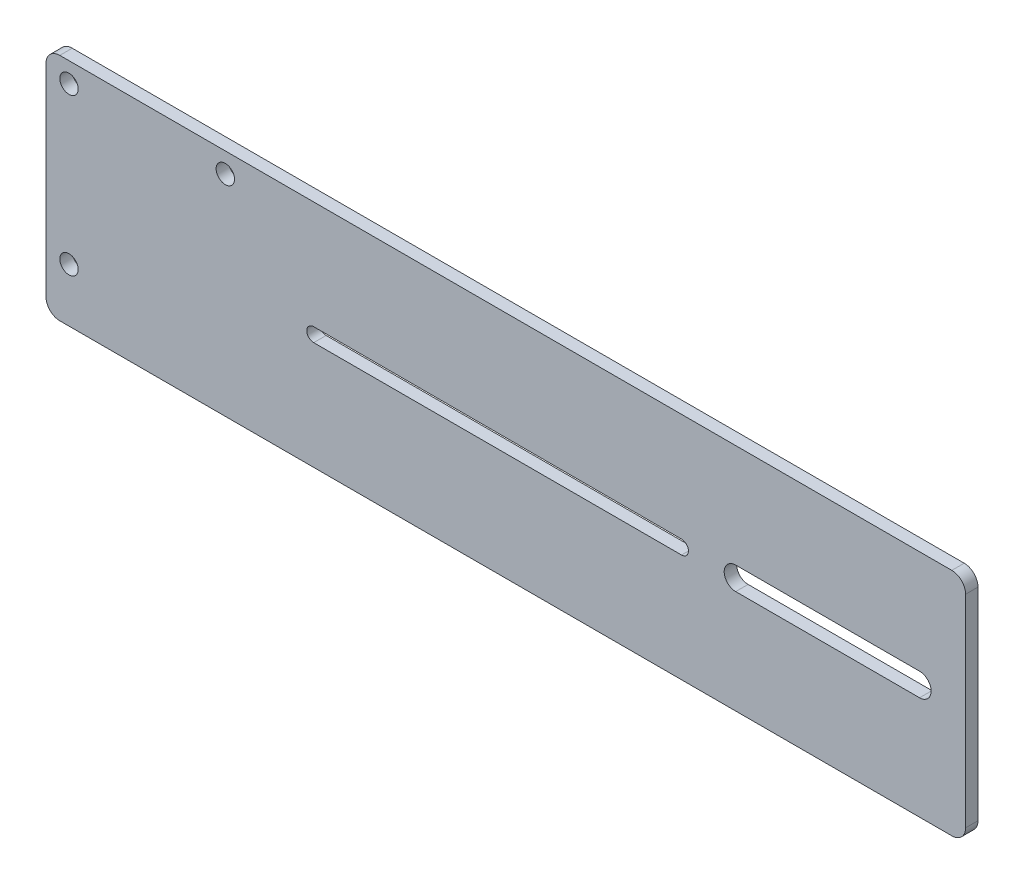
ISO-10303-21;
HEADER;
FILE_DESCRIPTION(('STEP AP214'),'2;1');
FILE_NAME('part.step','',(''),(''),'','','');
FILE_SCHEMA(('AUTOMOTIVE_DESIGN { 1 0 10303 214 1 1 1 1 }'));
ENDSEC;
DATA;
#1=APPLICATION_CONTEXT('core data for automotive mechanical design processes');
#2=APPLICATION_PROTOCOL_DEFINITION('international standard','automotive_design',2000,#1);
#3=PRODUCT_CONTEXT('',#1,'mechanical');
#4=PRODUCT('Part','Part','',(#3));
#5=PRODUCT_RELATED_PRODUCT_CATEGORY('part','',(#4));
#6=PRODUCT_DEFINITION_FORMATION('','',#4);
#7=PRODUCT_DEFINITION_CONTEXT('part definition',#1,'design');
#8=PRODUCT_DEFINITION('design','',#6,#7);
#9=PRODUCT_DEFINITION_SHAPE('','',#8);
#10=(LENGTH_UNIT() NAMED_UNIT(*) SI_UNIT(.MILLI.,.METRE.));
#11=(NAMED_UNIT(*) PLANE_ANGLE_UNIT() SI_UNIT($,.RADIAN.));
#12=(NAMED_UNIT(*) SI_UNIT($,.STERADIAN.) SOLID_ANGLE_UNIT());
#13=UNCERTAINTY_MEASURE_WITH_UNIT(LENGTH_MEASURE(1.E-05),#10,'distance_accuracy_value','');
#14=(GEOMETRIC_REPRESENTATION_CONTEXT(3) GLOBAL_UNCERTAINTY_ASSIGNED_CONTEXT((#13)) GLOBAL_UNIT_ASSIGNED_CONTEXT((#10,
#11,#12)) REPRESENTATION_CONTEXT('',''));
#15=CARTESIAN_POINT('',(0.,0.,0.));
#16=DIRECTION('',(0.,0.,1.));
#17=DIRECTION('',(1.,0.,0.));
#18=AXIS2_PLACEMENT_3D('',#15,#16,#17);
#19=CARTESIAN_POINT('',(3.,22.,2.7));
#20=DIRECTION('',(0.,0.,-1.));
#21=DIRECTION('',(-1.,0.,0.));
#22=AXIS2_PLACEMENT_3D('',#19,#20,#21);
#23=CYLINDRICAL_SURFACE('',#22,3.);
#24=CARTESIAN_POINT('',(3.,22.,0.));
#25=DIRECTION('',(0.,0.,1.));
#26=DIRECTION('',(1.,0.,0.));
#27=AXIS2_PLACEMENT_3D('',#24,#25,#26);
#28=CIRCLE('',#27,3.);
#29=CARTESIAN_POINT('',(0.,22.,0.));
#30=VERTEX_POINT('',#29);
#31=CARTESIAN_POINT('',(3.00000000000002,25.,0.));
#32=VERTEX_POINT('',#31);
#33=EDGE_CURVE('E222',#30,#32,#28,.F.);
#34=ORIENTED_EDGE('',*,*,#33,.F.);
#35=DIRECTION('',(0.,0.,-1.));
#36=VECTOR('',#35,1.);
#37=CARTESIAN_POINT('',(0.,22.,2.7));
#38=LINE('',#37,#36);
#39=CARTESIAN_POINT('',(0.,22.,2.7));
#40=VERTEX_POINT('',#39);
#41=EDGE_CURVE('E11',#40,#30,#38,.T.);
#42=ORIENTED_EDGE('',*,*,#41,.F.);
#43=CARTESIAN_POINT('',(3.,22.,2.7));
#44=DIRECTION('',(0.,0.,1.));
#45=DIRECTION('',(1.,0.,0.));
#46=AXIS2_PLACEMENT_3D('',#43,#44,#45);
#47=CIRCLE('',#46,3.);
#48=CARTESIAN_POINT('',(3.00000000000002,25.,2.7));
#49=VERTEX_POINT('',#48);
#50=EDGE_CURVE('E307',#40,#49,#47,.F.);
#51=ORIENTED_EDGE('',*,*,#50,.T.);
#52=DIRECTION('',(0.,0.,-1.));
#53=VECTOR('',#52,1.);
#54=CARTESIAN_POINT('',(3.00000000000002,25.,2.7));
#55=LINE('',#54,#53);
#56=EDGE_CURVE('E56',#49,#32,#55,.T.);
#57=ORIENTED_EDGE('',*,*,#56,.T.);
#58=EDGE_LOOP('',(#34,#42,#51,#57));
#59=FACE_BOUND('',#58,.T.);
#60=ADVANCED_FACE('F37',(#59),#23,.T.);
#61=CARTESIAN_POINT('',(0.,0.,2.7));
#62=DIRECTION('',(1.,0.,0.));
#63=DIRECTION('',(0.,1.,0.));
#64=AXIS2_PLACEMENT_3D('',#61,#62,#63);
#65=PLANE('',#64);
#66=DIRECTION('',(0.,-1.,0.));
#67=VECTOR('',#66,1.);
#68=CARTESIAN_POINT('',(0.,0.,0.));
#69=LINE('',#68,#67);
#70=CARTESIAN_POINT('',(0.,-22.,0.));
#71=VERTEX_POINT('',#70);
#72=EDGE_CURVE('E224',#30,#71,#69,.T.);
#73=ORIENTED_EDGE('',*,*,#72,.T.);
#74=DIRECTION('',(0.,0.,-1.));
#75=VECTOR('',#74,1.);
#76=CARTESIAN_POINT('',(0.,-22.,2.7));
#77=LINE('',#76,#75);
#78=CARTESIAN_POINT('',(0.,-22.,2.7));
#79=VERTEX_POINT('',#78);
#80=EDGE_CURVE('E47',#79,#71,#77,.T.);
#81=ORIENTED_EDGE('',*,*,#80,.F.);
#82=DIRECTION('',(0.,-1.,0.));
#83=VECTOR('',#82,1.);
#84=CARTESIAN_POINT('',(0.,0.,2.7));
#85=LINE('',#84,#83);
#86=EDGE_CURVE('E309',#40,#79,#85,.T.);
#87=ORIENTED_EDGE('',*,*,#86,.F.);
#88=ORIENTED_EDGE('',*,*,#41,.T.);
#89=EDGE_LOOP('',(#73,#81,#87,#88));
#90=FACE_BOUND('',#89,.T.);
#91=ADVANCED_FACE('F336',(#90),#65,.F.);
#92=CARTESIAN_POINT('',(3.00000000000001,-22.,2.7));
#93=DIRECTION('',(0.,0.,-1.));
#94=DIRECTION('',(-1.,0.,0.));
#95=AXIS2_PLACEMENT_3D('',#92,#93,#94);
#96=CYLINDRICAL_SURFACE('',#95,3.);
#97=CARTESIAN_POINT('',(3.00000000000001,-22.,0.));
#98=DIRECTION('',(0.,0.,1.));
#99=DIRECTION('',(1.,0.,0.));
#100=AXIS2_PLACEMENT_3D('',#97,#98,#99);
#101=CIRCLE('',#100,3.);
#102=CARTESIAN_POINT('',(3.00000000000003,-25.,0.));
#103=VERTEX_POINT('',#102);
#104=EDGE_CURVE('E227',#71,#103,#101,.T.);
#105=ORIENTED_EDGE('',*,*,#104,.T.);
#106=DIRECTION('',(0.,0.,-1.));
#107=VECTOR('',#106,1.);
#108=CARTESIAN_POINT('',(3.00000000000003,-25.,2.7));
#109=LINE('',#108,#107);
#110=CARTESIAN_POINT('',(3.00000000000003,-25.,2.7));
#111=VERTEX_POINT('',#110);
#112=EDGE_CURVE('E248',#111,#103,#109,.T.);
#113=ORIENTED_EDGE('',*,*,#112,.F.);
#114=CARTESIAN_POINT('',(3.00000000000001,-22.,2.7));
#115=DIRECTION('',(0.,0.,1.));
#116=DIRECTION('',(1.,0.,0.));
#117=AXIS2_PLACEMENT_3D('',#114,#115,#116);
#118=CIRCLE('',#117,3.);
#119=EDGE_CURVE('E312',#79,#111,#118,.T.);
#120=ORIENTED_EDGE('',*,*,#119,.F.);
#121=ORIENTED_EDGE('',*,*,#80,.T.);
#122=EDGE_LOOP('',(#105,#113,#120,#121));
#123=FACE_BOUND('',#122,.T.);
#124=ADVANCED_FACE('F341',(#123),#96,.T.);
#125=CARTESIAN_POINT('',(0.,-25.,2.7));
#126=DIRECTION('',(0.,1.,0.));
#127=DIRECTION('',(0.,0.,1.));
#128=AXIS2_PLACEMENT_3D('',#125,#126,#127);
#129=PLANE('',#128);
#130=DIRECTION('',(1.,0.,0.));
#131=VECTOR('',#130,1.);
#132=CARTESIAN_POINT('',(0.,-25.,0.));
#133=LINE('',#132,#131);
#134=CARTESIAN_POINT('',(197.,-25.,0.));
#135=VERTEX_POINT('',#134);
#136=EDGE_CURVE('E230',#103,#135,#133,.T.);
#137=ORIENTED_EDGE('',*,*,#136,.T.);
#138=DIRECTION('',(0.,0.,-1.));
#139=VECTOR('',#138,1.);
#140=CARTESIAN_POINT('',(197.,-25.,2.7));
#141=LINE('',#140,#139);
#142=CARTESIAN_POINT('',(197.,-25.,2.7));
#143=VERTEX_POINT('',#142);
#144=EDGE_CURVE('E246',#143,#135,#141,.T.);
#145=ORIENTED_EDGE('',*,*,#144,.F.);
#146=DIRECTION('',(1.,0.,0.));
#147=VECTOR('',#146,1.);
#148=CARTESIAN_POINT('',(0.,-25.,2.7));
#149=LINE('',#148,#147);
#150=EDGE_CURVE('E183',#111,#143,#149,.T.);
#151=ORIENTED_EDGE('',*,*,#150,.F.);
#152=ORIENTED_EDGE('',*,*,#112,.T.);
#153=EDGE_LOOP('',(#137,#145,#151,#152));
#154=FACE_BOUND('',#153,.T.);
#155=ADVANCED_FACE('F317',(#154),#129,.F.);
#156=CARTESIAN_POINT('',(197.,-22.,2.7));
#157=DIRECTION('',(0.,0.,-1.));
#158=DIRECTION('',(-1.,0.,0.));
#159=AXIS2_PLACEMENT_3D('',#156,#157,#158);
#160=CYLINDRICAL_SURFACE('',#159,3.);
#161=CARTESIAN_POINT('',(197.,-22.,0.));
#162=DIRECTION('',(0.,0.,1.));
#163=DIRECTION('',(1.,0.,0.));
#164=AXIS2_PLACEMENT_3D('',#161,#162,#163);
#165=CIRCLE('',#164,3.);
#166=CARTESIAN_POINT('',(200.,-22.,0.));
#167=VERTEX_POINT('',#166);
#168=EDGE_CURVE('E233',#167,#135,#165,.F.);
#169=ORIENTED_EDGE('',*,*,#168,.F.);
#170=DIRECTION('',(0.,0.,-1.));
#171=VECTOR('',#170,1.);
#172=CARTESIAN_POINT('',(200.,-22.,2.7));
#173=LINE('',#172,#171);
#174=CARTESIAN_POINT('',(200.,-22.,2.7));
#175=VERTEX_POINT('',#174);
#176=EDGE_CURVE('E169',#175,#167,#173,.T.);
#177=ORIENTED_EDGE('',*,*,#176,.F.);
#178=CARTESIAN_POINT('',(197.,-22.,2.7));
#179=DIRECTION('',(0.,0.,1.));
#180=DIRECTION('',(1.,0.,0.));
#181=AXIS2_PLACEMENT_3D('',#178,#179,#180);
#182=CIRCLE('',#181,3.);
#183=EDGE_CURVE('E181',#175,#143,#182,.F.);
#184=ORIENTED_EDGE('',*,*,#183,.T.);
#185=ORIENTED_EDGE('',*,*,#144,.T.);
#186=EDGE_LOOP('',(#169,#177,#184,#185));
#187=FACE_BOUND('',#186,.T.);
#188=ADVANCED_FACE('F320',(#187),#160,.T.);
#189=CARTESIAN_POINT('',(200.,0.,2.7));
#190=DIRECTION('',(1.,0.,0.));
#191=DIRECTION('',(0.,0.,-1.));
#192=AXIS2_PLACEMENT_3D('',#189,#190,#191);
#193=PLANE('',#192);
#194=DIRECTION('',(0.,-1.,0.));
#195=VECTOR('',#194,1.);
#196=CARTESIAN_POINT('',(200.,0.,0.));
#197=LINE('',#196,#195);
#198=CARTESIAN_POINT('',(200.,22.,0.));
#199=VERTEX_POINT('',#198);
#200=EDGE_CURVE('E166',#199,#167,#197,.T.);
#201=ORIENTED_EDGE('',*,*,#200,.F.);
#202=DIRECTION('',(0.,0.,-1.));
#203=VECTOR('',#202,1.);
#204=CARTESIAN_POINT('',(200.,22.,2.7));
#205=LINE('',#204,#203);
#206=CARTESIAN_POINT('',(200.,22.,2.7));
#207=VERTEX_POINT('',#206);
#208=EDGE_CURVE('E160',#207,#199,#205,.T.);
#209=ORIENTED_EDGE('',*,*,#208,.F.);
#210=DIRECTION('',(0.,-1.,0.));
#211=VECTOR('',#210,1.);
#212=CARTESIAN_POINT('',(200.,0.,2.7));
#213=LINE('',#212,#211);
#214=EDGE_CURVE('E164',#207,#175,#213,.T.);
#215=ORIENTED_EDGE('',*,*,#214,.T.);
#216=ORIENTED_EDGE('',*,*,#176,.T.);
#217=EDGE_LOOP('',(#201,#209,#215,#216));
#218=FACE_BOUND('',#217,.T.);
#219=ADVANCED_FACE('F162',(#218),#193,.T.);
#220=CARTESIAN_POINT('',(197.,22.,2.7));
#221=DIRECTION('',(0.,0.,-1.));
#222=DIRECTION('',(-1.,0.,0.));
#223=AXIS2_PLACEMENT_3D('',#220,#221,#222);
#224=CYLINDRICAL_SURFACE('',#223,3.);
#225=CARTESIAN_POINT('',(197.,22.,0.));
#226=DIRECTION('',(0.,0.,1.));
#227=DIRECTION('',(1.,0.,0.));
#228=AXIS2_PLACEMENT_3D('',#225,#226,#227);
#229=CIRCLE('',#228,3.);
#230=CARTESIAN_POINT('',(197.,25.,0.));
#231=VERTEX_POINT('',#230);
#232=EDGE_CURVE('E237',#199,#231,#229,.T.);
#233=ORIENTED_EDGE('',*,*,#232,.T.);
#234=DIRECTION('',(0.,0.,-1.));
#235=VECTOR('',#234,1.);
#236=CARTESIAN_POINT('',(197.,25.,2.7));
#237=LINE('',#236,#235);
#238=CARTESIAN_POINT('',(197.,25.,2.7));
#239=VERTEX_POINT('',#238);
#240=EDGE_CURVE('E106',#239,#231,#237,.T.);
#241=ORIENTED_EDGE('',*,*,#240,.F.);
#242=CARTESIAN_POINT('',(197.,22.,2.7));
#243=DIRECTION('',(0.,0.,1.));
#244=DIRECTION('',(1.,0.,0.));
#245=AXIS2_PLACEMENT_3D('',#242,#243,#244);
#246=CIRCLE('',#245,3.);
#247=EDGE_CURVE('E171',#207,#239,#246,.T.);
#248=ORIENTED_EDGE('',*,*,#247,.F.);
#249=ORIENTED_EDGE('',*,*,#208,.T.);
#250=EDGE_LOOP('',(#233,#241,#248,#249));
#251=FACE_BOUND('',#250,.T.);
#252=ADVANCED_FACE('F172',(#251),#224,.T.);
#253=CARTESIAN_POINT('',(0.,-2.5,2.7));
#254=DIRECTION('',(0.,-1.,0.));
#255=DIRECTION('',(1.,0.,0.));
#256=AXIS2_PLACEMENT_3D('',#253,#254,#255);
#257=PLANE('',#256);
#258=DIRECTION('',(-1.,0.,0.));
#259=VECTOR('',#258,1.);
#260=CARTESIAN_POINT('',(0.,-2.5,0.));
#261=LINE('',#260,#259);
#262=CARTESIAN_POINT('',(190.,-2.5,0.));
#263=VERTEX_POINT('',#262);
#264=CARTESIAN_POINT('',(150.,-2.5,0.));
#265=VERTEX_POINT('',#264);
#266=EDGE_CURVE('E201',#263,#265,#261,.T.);
#267=ORIENTED_EDGE('',*,*,#266,.T.);
#268=DIRECTION('',(0.,0.,-1.));
#269=VECTOR('',#268,1.);
#270=CARTESIAN_POINT('',(150.,-2.5,2.7));
#271=LINE('',#270,#269);
#272=CARTESIAN_POINT('',(150.,-2.5,2.7));
#273=VERTEX_POINT('',#272);
#274=EDGE_CURVE('E243',#273,#265,#271,.T.);
#275=ORIENTED_EDGE('',*,*,#274,.F.);
#276=DIRECTION('',(-1.,0.,0.));
#277=VECTOR('',#276,1.);
#278=CARTESIAN_POINT('',(0.,-2.5,2.7));
#279=LINE('',#278,#277);
#280=CARTESIAN_POINT('',(190.,-2.5,2.7));
#281=VERTEX_POINT('',#280);
#282=EDGE_CURVE('E284',#281,#273,#279,.T.);
#283=ORIENTED_EDGE('',*,*,#282,.F.);
#284=DIRECTION('',(0.,0.,-1.));
#285=VECTOR('',#284,1.);
#286=CARTESIAN_POINT('',(190.,-2.5,2.7));
#287=LINE('',#286,#285);
#288=EDGE_CURVE('E253',#281,#263,#287,.T.);
#289=ORIENTED_EDGE('',*,*,#288,.T.);
#290=EDGE_LOOP('',(#267,#275,#283,#289));
#291=FACE_BOUND('',#290,.T.);
#292=ADVANCED_FACE('F368',(#291),#257,.F.);
#293=CARTESIAN_POINT('',(150.,0.,2.7));
#294=DIRECTION('',(0.,0.,-1.));
#295=DIRECTION('',(-1.,0.,0.));
#296=AXIS2_PLACEMENT_3D('',#293,#294,#295);
#297=CYLINDRICAL_SURFACE('',#296,2.5);
#298=CARTESIAN_POINT('',(150.,0.,0.));
#299=DIRECTION('',(0.,0.,1.));
#300=DIRECTION('',(1.,0.,0.));
#301=AXIS2_PLACEMENT_3D('',#298,#299,#300);
#302=CIRCLE('',#301,2.5);
#303=CARTESIAN_POINT('',(150.,2.5,0.));
#304=VERTEX_POINT('',#303);
#305=EDGE_CURVE('E204',#304,#265,#302,.T.);
#306=ORIENTED_EDGE('',*,*,#305,.F.);
#307=DIRECTION('',(0.,0.,-1.));
#308=VECTOR('',#307,1.);
#309=CARTESIAN_POINT('',(150.,2.5,2.7));
#310=LINE('',#309,#308);
#311=CARTESIAN_POINT('',(150.,2.5,2.7));
#312=VERTEX_POINT('',#311);
#313=EDGE_CURVE('E257',#312,#304,#310,.T.);
#314=ORIENTED_EDGE('',*,*,#313,.F.);
#315=CARTESIAN_POINT('',(150.,0.,2.7));
#316=DIRECTION('',(0.,0.,1.));
#317=DIRECTION('',(1.,0.,0.));
#318=AXIS2_PLACEMENT_3D('',#315,#316,#317);
#319=CIRCLE('',#318,2.5);
#320=EDGE_CURVE('E286',#312,#273,#319,.T.);
#321=ORIENTED_EDGE('',*,*,#320,.T.);
#322=ORIENTED_EDGE('',*,*,#274,.T.);
#323=EDGE_LOOP('',(#306,#314,#321,#322));
#324=FACE_BOUND('',#323,.T.);
#325=ADVANCED_FACE('F364',(#324),#297,.F.);
#326=CARTESIAN_POINT('',(0.,2.5,2.7));
#327=DIRECTION('',(0.,1.,0.));
#328=DIRECTION('',(0.,0.,1.));
#329=AXIS2_PLACEMENT_3D('',#326,#327,#328);
#330=PLANE('',#329);
#331=DIRECTION('',(1.,0.,0.));
#332=VECTOR('',#331,1.);
#333=CARTESIAN_POINT('',(0.,2.5,0.));
#334=LINE('',#333,#332);
#335=CARTESIAN_POINT('',(190.,2.5,0.));
#336=VERTEX_POINT('',#335);
#337=EDGE_CURVE('E207',#304,#336,#334,.T.);
#338=ORIENTED_EDGE('',*,*,#337,.T.);
#339=DIRECTION('',(0.,0.,-1.));
#340=VECTOR('',#339,1.);
#341=CARTESIAN_POINT('',(190.,2.5,2.7));
#342=LINE('',#341,#340);
#343=CARTESIAN_POINT('',(190.,2.5,2.7));
#344=VERTEX_POINT('',#343);
#345=EDGE_CURVE('E255',#344,#336,#342,.T.);
#346=ORIENTED_EDGE('',*,*,#345,.F.);
#347=DIRECTION('',(1.,0.,0.));
#348=VECTOR('',#347,1.);
#349=CARTESIAN_POINT('',(0.,2.5,2.7));
#350=LINE('',#349,#348);
#351=EDGE_CURVE('E293',#312,#344,#350,.T.);
#352=ORIENTED_EDGE('',*,*,#351,.F.);
#353=ORIENTED_EDGE('',*,*,#313,.T.);
#354=EDGE_LOOP('',(#338,#346,#352,#353));
#355=FACE_BOUND('',#354,.T.);
#356=ADVANCED_FACE('F361',(#355),#330,.F.);
#357=CARTESIAN_POINT('',(0.,-1.5,2.7));
#358=DIRECTION('',(0.,-1.,0.));
#359=DIRECTION('',(0.,0.,-1.));
#360=AXIS2_PLACEMENT_3D('',#357,#358,#359);
#361=PLANE('',#360);
#362=DIRECTION('',(-1.,0.,0.));
#363=VECTOR('',#362,1.);
#364=CARTESIAN_POINT('',(0.,-1.5,0.));
#365=LINE('',#364,#363);
#366=CARTESIAN_POINT('',(138.219392867782,-1.5,0.));
#367=VERTEX_POINT('',#366);
#368=CARTESIAN_POINT('',(58.2193928677821,-1.5,0.));
#369=VERTEX_POINT('',#368);
#370=EDGE_CURVE('E189',#367,#369,#365,.T.);
#371=ORIENTED_EDGE('',*,*,#370,.T.);
#372=DIRECTION('',(0.,0.,-1.));
#373=VECTOR('',#372,1.);
#374=CARTESIAN_POINT('',(58.2193928677821,-1.5,2.7));
#375=LINE('',#374,#373);
#376=CARTESIAN_POINT('',(58.2193928677821,-1.5,2.7));
#377=VERTEX_POINT('',#376);
#378=EDGE_CURVE('E41',#377,#369,#375,.T.);
#379=ORIENTED_EDGE('',*,*,#378,.F.);
#380=DIRECTION('',(-1.,0.,0.));
#381=VECTOR('',#380,1.);
#382=CARTESIAN_POINT('',(0.,-1.5,2.7));
#383=LINE('',#382,#381);
#384=CARTESIAN_POINT('',(138.219392867782,-1.5,2.7));
#385=VERTEX_POINT('',#384);
#386=EDGE_CURVE('E119',#385,#377,#383,.T.);
#387=ORIENTED_EDGE('',*,*,#386,.F.);
#388=DIRECTION('',(0.,0.,-1.));
#389=VECTOR('',#388,1.);
#390=CARTESIAN_POINT('',(138.219392867782,-1.5,2.7));
#391=LINE('',#390,#389);
#392=EDGE_CURVE('E188',#385,#367,#391,.T.);
#393=ORIENTED_EDGE('',*,*,#392,.T.);
#394=EDGE_LOOP('',(#371,#379,#387,#393));
#395=FACE_BOUND('',#394,.T.);
#396=ADVANCED_FACE('F39',(#395),#361,.F.);
#397=CARTESIAN_POINT('',(58.2193928677821,0.,2.7));
#398=DIRECTION('',(0.,0.,-1.));
#399=DIRECTION('',(-1.,0.,0.));
#400=AXIS2_PLACEMENT_3D('',#397,#398,#399);
#401=CYLINDRICAL_SURFACE('',#400,1.5);
#402=CARTESIAN_POINT('',(58.2193928677821,0.,0.));
#403=DIRECTION('',(0.,0.,1.));
#404=DIRECTION('',(1.,0.,0.));
#405=AXIS2_PLACEMENT_3D('',#402,#403,#404);
#406=CIRCLE('',#405,1.5);
#407=CARTESIAN_POINT('',(58.2193928677821,1.5,0.));
#408=VERTEX_POINT('',#407);
#409=EDGE_CURVE('E192',#408,#369,#406,.T.);
#410=ORIENTED_EDGE('',*,*,#409,.F.);
#411=DIRECTION('',(0.,0.,-1.));
#412=VECTOR('',#411,1.);
#413=CARTESIAN_POINT('',(58.2193928677821,1.5,2.7));
#414=LINE('',#413,#412);
#415=CARTESIAN_POINT('',(58.2193928677821,1.5,2.7));
#416=VERTEX_POINT('',#415);
#417=EDGE_CURVE('E262',#416,#408,#414,.T.);
#418=ORIENTED_EDGE('',*,*,#417,.F.);
#419=CARTESIAN_POINT('',(58.2193928677821,0.,2.7));
#420=DIRECTION('',(0.,0.,1.));
#421=DIRECTION('',(1.,0.,0.));
#422=AXIS2_PLACEMENT_3D('',#419,#420,#421);
#423=CIRCLE('',#422,1.5);
#424=EDGE_CURVE('E270',#416,#377,#423,.T.);
#425=ORIENTED_EDGE('',*,*,#424,.T.);
#426=ORIENTED_EDGE('',*,*,#378,.T.);
#427=EDGE_LOOP('',(#410,#418,#425,#426));
#428=FACE_BOUND('',#427,.T.);
#429=ADVANCED_FACE('F269',(#428),#401,.F.);
#430=CARTESIAN_POINT('',(0.,1.5,2.7));
#431=DIRECTION('',(0.,1.,0.));
#432=DIRECTION('',(0.,0.,1.));
#433=AXIS2_PLACEMENT_3D('',#430,#431,#432);
#434=PLANE('',#433);
#435=DIRECTION('',(1.,0.,0.));
#436=VECTOR('',#435,1.);
#437=CARTESIAN_POINT('',(0.,1.5,0.));
#438=LINE('',#437,#436);
#439=CARTESIAN_POINT('',(138.219392867782,1.5,0.));
#440=VERTEX_POINT('',#439);
#441=EDGE_CURVE('E195',#408,#440,#438,.T.);
#442=ORIENTED_EDGE('',*,*,#441,.T.);
#443=DIRECTION('',(0.,0.,-1.));
#444=VECTOR('',#443,1.);
#445=CARTESIAN_POINT('',(138.219392867782,1.5,2.7));
#446=LINE('',#445,#444);
#447=CARTESIAN_POINT('',(138.219392867782,1.5,2.7));
#448=VERTEX_POINT('',#447);
#449=EDGE_CURVE('E261',#448,#440,#446,.T.);
#450=ORIENTED_EDGE('',*,*,#449,.F.);
#451=DIRECTION('',(1.,0.,0.));
#452=VECTOR('',#451,1.);
#453=CARTESIAN_POINT('',(0.,1.5,2.7));
#454=LINE('',#453,#452);
#455=EDGE_CURVE('E280',#416,#448,#454,.T.);
#456=ORIENTED_EDGE('',*,*,#455,.F.);
#457=ORIENTED_EDGE('',*,*,#417,.T.);
#458=EDGE_LOOP('',(#442,#450,#456,#457));
#459=FACE_BOUND('',#458,.T.);
#460=ADVANCED_FACE('F278',(#459),#434,.F.);
#461=CARTESIAN_POINT('',(5.,20.65,2.7));
#462=DIRECTION('',(0.,0.,-1.));
#463=DIRECTION('',(-1.,0.,0.));
#464=AXIS2_PLACEMENT_3D('',#461,#462,#463);
#465=CYLINDRICAL_SURFACE('',#464,2.);
#466=CARTESIAN_POINT('',(5.,20.65,2.7));
#467=DIRECTION('',(0.,0.,1.));
#468=DIRECTION('',(1.,0.,0.));
#469=AXIS2_PLACEMENT_3D('',#466,#467,#468);
#470=CIRCLE('',#469,2.);
#471=CARTESIAN_POINT('',(3.,20.65,2.7));
#472=VERTEX_POINT('',#471);
#473=EDGE_CURVE('E304',#472,#472,#470,.T.);
#474=CARTESIAN_POINT('',(5.,20.65,0.));
#475=DIRECTION('',(0.,0.,1.));
#476=DIRECTION('',(1.,0.,0.));
#477=AXIS2_PLACEMENT_3D('',#474,#475,#476);
#478=CIRCLE('',#477,2.);
#479=CARTESIAN_POINT('',(3.,20.65,0.));
#480=VERTEX_POINT('',#479);
#481=EDGE_CURVE('E219',#480,#480,#478,.T.);
#482=CARTESIAN_POINT('',(3.,20.65,2.7));
#483=CARTESIAN_POINT('',(3.,20.65,2.671875));
#484=CARTESIAN_POINT('',(3.,20.65,2.64375));
#485=CARTESIAN_POINT('',(3.,20.65,2.5875));
#486=CARTESIAN_POINT('',(3.,20.65,2.559375));
#487=CARTESIAN_POINT('',(3.,20.65,2.503125));
#488=CARTESIAN_POINT('',(3.,20.65,2.475));
#489=CARTESIAN_POINT('',(3.,20.65,2.41875));
#490=CARTESIAN_POINT('',(3.,20.65,2.390625));
#491=CARTESIAN_POINT('',(3.,20.65,2.334375));
#492=CARTESIAN_POINT('',(3.,20.65,2.30625));
#493=CARTESIAN_POINT('',(3.,20.65,2.25));
#494=CARTESIAN_POINT('',(3.,20.65,2.221875));
#495=CARTESIAN_POINT('',(3.,20.65,2.165625));
#496=CARTESIAN_POINT('',(3.,20.65,2.1375));
#497=CARTESIAN_POINT('',(3.,20.65,2.08125));
#498=CARTESIAN_POINT('',(3.,20.65,2.053125));
#499=CARTESIAN_POINT('',(3.,20.65,1.996875));
#500=CARTESIAN_POINT('',(3.,20.65,1.96875));
#501=CARTESIAN_POINT('',(3.,20.65,1.9125));
#502=CARTESIAN_POINT('',(3.,20.65,1.884375));
#503=CARTESIAN_POINT('',(3.,20.65,1.828125));
#504=CARTESIAN_POINT('',(3.,20.65,1.8));
#505=CARTESIAN_POINT('',(3.,20.65,1.74375));
#506=CARTESIAN_POINT('',(3.,20.65,1.715625));
#507=CARTESIAN_POINT('',(3.,20.65,1.659375));
#508=CARTESIAN_POINT('',(3.,20.65,1.63125));
#509=CARTESIAN_POINT('',(3.,20.65,1.575));
#510=CARTESIAN_POINT('',(3.,20.65,1.546875));
#511=CARTESIAN_POINT('',(3.,20.65,1.490625));
#512=CARTESIAN_POINT('',(3.,20.65,1.4625));
#513=CARTESIAN_POINT('',(3.,20.65,1.40625));
#514=CARTESIAN_POINT('',(3.,20.65,1.378125));
#515=CARTESIAN_POINT('',(3.,20.65,1.321875));
#516=CARTESIAN_POINT('',(3.,20.65,1.29375));
#517=CARTESIAN_POINT('',(3.,20.65,1.2375));
#518=CARTESIAN_POINT('',(3.,20.65,1.209375));
#519=CARTESIAN_POINT('',(3.,20.65,1.153125));
#520=CARTESIAN_POINT('',(3.,20.65,1.125));
#521=CARTESIAN_POINT('',(3.,20.65,1.06875));
#522=CARTESIAN_POINT('',(3.,20.65,1.040625));
#523=CARTESIAN_POINT('',(3.,20.65,0.984375));
#524=CARTESIAN_POINT('',(3.,20.65,0.956249999999999));
#525=CARTESIAN_POINT('',(3.,20.65,0.899999999999999));
#526=CARTESIAN_POINT('',(3.,20.65,0.871875));
#527=CARTESIAN_POINT('',(3.,20.65,0.815624999999999));
#528=CARTESIAN_POINT('',(3.,20.65,0.787499999999999));
#529=CARTESIAN_POINT('',(3.,20.65,0.73125));
#530=CARTESIAN_POINT('',(3.,20.65,0.703125));
#531=CARTESIAN_POINT('',(3.,20.65,0.646875));
#532=CARTESIAN_POINT('',(3.,20.65,0.61875));
#533=CARTESIAN_POINT('',(3.,20.65,0.5625));
#534=CARTESIAN_POINT('',(3.,20.65,0.534375));
#535=CARTESIAN_POINT('',(3.,20.65,0.478125));
#536=CARTESIAN_POINT('',(3.,20.65,0.45));
#537=CARTESIAN_POINT('',(3.,20.65,0.39375));
#538=CARTESIAN_POINT('',(3.,20.65,0.365625));
#539=CARTESIAN_POINT('',(3.,20.65,0.309375));
#540=CARTESIAN_POINT('',(3.,20.65,0.28125));
#541=CARTESIAN_POINT('',(3.,20.65,0.225));
#542=CARTESIAN_POINT('',(3.,20.65,0.196875));
#543=CARTESIAN_POINT('',(3.,20.65,0.140625));
#544=CARTESIAN_POINT('',(3.,20.65,0.1125));
#545=CARTESIAN_POINT('',(3.,20.65,0.0562499999999997));
#546=CARTESIAN_POINT('',(3.,20.65,0.0281249999999996));
#547=CARTESIAN_POINT('',(3.,20.65,0.));
#548=B_SPLINE_CURVE_WITH_KNOTS('',3,(#482,#483,#484,#485,#486,#487,#488,#489,#490,#491,#492,
#493,#494,#495,#496,#497,#498,#499,#500,#501,#502,#503,#504,#505,#506,#507,#508,#509,#510,#511,
#512,#513,#514,#515,#516,#517,#518,#519,#520,#521,#522,#523,#524,#525,#526,#527,#528,#529,#530,
#531,#532,#533,#534,#535,#536,#537,#538,#539,#540,#541,#542,#543,#544,#545,#546,#547),
.UNSPECIFIED.,.F.,.F.,(4,2,2,2,2,2,2,2,2,2,2,2,2,2,2,2,2,2,2,2,2,2,2,2,2,2,2,2,2,2,2,2,4),(0.,
0.0843750000000003,0.16875,0.253125,0.3375,0.421875,0.50625,0.590625,0.675,0.759375,0.84375,
0.928125000000001,1.0125,1.096875,1.18125,1.265625,1.35,1.434375,1.51875,1.603125,1.6875,
1.771875,1.85625,1.940625,2.025,2.109375,2.19375,2.278125,2.3625,2.446875,2.53125,2.615625,2.7),.UNSPECIFIED.);
#549=EDGE_CURVE('BSEAM346',#472,#480,#548,.T.);
#550=ORIENTED_EDGE('',*,*,#473,.T.);
#551=ORIENTED_EDGE('',*,*,#481,.F.);
#552=ORIENTED_EDGE('',*,*,#549,.T.);
#553=ORIENTED_EDGE('',*,*,#549,.F.);
#554=EDGE_LOOP('',(#550,#552,#551,#553));
#555=FACE_BOUND('',#554,.T.);
#556=ADVANCED_FACE('F346',(#555),#465,.F.);
#557=CARTESIAN_POINT('',(39.,20.65,2.7));
#558=DIRECTION('',(0.,0.,-1.));
#559=DIRECTION('',(-1.,0.,0.));
#560=AXIS2_PLACEMENT_3D('',#557,#558,#559);
#561=CYLINDRICAL_SURFACE('',#560,2.);
#562=CARTESIAN_POINT('',(39.,20.65,2.7));
#563=DIRECTION('',(0.,0.,1.));
#564=DIRECTION('',(1.,0.,0.));
#565=AXIS2_PLACEMENT_3D('',#562,#563,#564);
#566=CIRCLE('',#565,2.);
#567=CARTESIAN_POINT('',(37.,20.65,2.7));
#568=VERTEX_POINT('',#567);
#569=EDGE_CURVE('E301',#568,#568,#566,.T.);
#570=CARTESIAN_POINT('',(39.,20.65,0.));
#571=DIRECTION('',(0.,0.,1.));
#572=DIRECTION('',(1.,0.,0.));
#573=AXIS2_PLACEMENT_3D('',#570,#571,#572);
#574=CIRCLE('',#573,2.);
#575=CARTESIAN_POINT('',(37.,20.65,0.));
#576=VERTEX_POINT('',#575);
#577=EDGE_CURVE('E216',#576,#576,#574,.T.);
#578=CARTESIAN_POINT('',(37.,20.65,2.7));
#579=CARTESIAN_POINT('',(37.,20.65,2.671875));
#580=CARTESIAN_POINT('',(37.,20.65,2.64375));
#581=CARTESIAN_POINT('',(37.,20.65,2.5875));
#582=CARTESIAN_POINT('',(37.,20.65,2.559375));
#583=CARTESIAN_POINT('',(37.,20.65,2.503125));
#584=CARTESIAN_POINT('',(37.,20.65,2.475));
#585=CARTESIAN_POINT('',(37.,20.65,2.41875));
#586=CARTESIAN_POINT('',(37.,20.65,2.390625));
#587=CARTESIAN_POINT('',(37.,20.65,2.334375));
#588=CARTESIAN_POINT('',(37.,20.65,2.30625));
#589=CARTESIAN_POINT('',(37.,20.65,2.25));
#590=CARTESIAN_POINT('',(37.,20.65,2.221875));
#591=CARTESIAN_POINT('',(37.,20.65,2.165625));
#592=CARTESIAN_POINT('',(37.,20.65,2.1375));
#593=CARTESIAN_POINT('',(37.,20.65,2.08125));
#594=CARTESIAN_POINT('',(37.,20.65,2.053125));
#595=CARTESIAN_POINT('',(37.,20.65,1.996875));
#596=CARTESIAN_POINT('',(37.,20.65,1.96875));
#597=CARTESIAN_POINT('',(37.,20.65,1.9125));
#598=CARTESIAN_POINT('',(37.,20.65,1.884375));
#599=CARTESIAN_POINT('',(37.,20.65,1.828125));
#600=CARTESIAN_POINT('',(37.,20.65,1.8));
#601=CARTESIAN_POINT('',(37.,20.65,1.74375));
#602=CARTESIAN_POINT('',(37.,20.65,1.715625));
#603=CARTESIAN_POINT('',(37.,20.65,1.659375));
#604=CARTESIAN_POINT('',(37.,20.65,1.63125));
#605=CARTESIAN_POINT('',(37.,20.65,1.575));
#606=CARTESIAN_POINT('',(37.,20.65,1.546875));
#607=CARTESIAN_POINT('',(37.,20.65,1.490625));
#608=CARTESIAN_POINT('',(37.,20.65,1.4625));
#609=CARTESIAN_POINT('',(37.,20.65,1.40625));
#610=CARTESIAN_POINT('',(37.,20.65,1.378125));
#611=CARTESIAN_POINT('',(37.,20.65,1.321875));
#612=CARTESIAN_POINT('',(37.,20.65,1.29375));
#613=CARTESIAN_POINT('',(37.,20.65,1.2375));
#614=CARTESIAN_POINT('',(37.,20.65,1.209375));
#615=CARTESIAN_POINT('',(37.,20.65,1.153125));
#616=CARTESIAN_POINT('',(37.,20.65,1.125));
#617=CARTESIAN_POINT('',(37.,20.65,1.06875));
#618=CARTESIAN_POINT('',(37.,20.65,1.040625));
#619=CARTESIAN_POINT('',(37.,20.65,0.984375));
#620=CARTESIAN_POINT('',(37.,20.65,0.956249999999999));
#621=CARTESIAN_POINT('',(37.,20.65,0.899999999999999));
#622=CARTESIAN_POINT('',(37.,20.65,0.871875));
#623=CARTESIAN_POINT('',(37.,20.65,0.815624999999999));
#624=CARTESIAN_POINT('',(37.,20.65,0.787499999999999));
#625=CARTESIAN_POINT('',(37.,20.65,0.73125));
#626=CARTESIAN_POINT('',(37.,20.65,0.703125));
#627=CARTESIAN_POINT('',(37.,20.65,0.646875));
#628=CARTESIAN_POINT('',(37.,20.65,0.61875));
#629=CARTESIAN_POINT('',(37.,20.65,0.5625));
#630=CARTESIAN_POINT('',(37.,20.65,0.534375));
#631=CARTESIAN_POINT('',(37.,20.65,0.478125));
#632=CARTESIAN_POINT('',(37.,20.65,0.45));
#633=CARTESIAN_POINT('',(37.,20.65,0.39375));
#634=CARTESIAN_POINT('',(37.,20.65,0.365625));
#635=CARTESIAN_POINT('',(37.,20.65,0.309375));
#636=CARTESIAN_POINT('',(37.,20.65,0.28125));
#637=CARTESIAN_POINT('',(37.,20.65,0.225));
#638=CARTESIAN_POINT('',(37.,20.65,0.196875));
#639=CARTESIAN_POINT('',(37.,20.65,0.140625));
#640=CARTESIAN_POINT('',(37.,20.65,0.1125));
#641=CARTESIAN_POINT('',(37.,20.65,0.0562499999999997));
#642=CARTESIAN_POINT('',(37.,20.65,0.0281249999999996));
#643=CARTESIAN_POINT('',(37.,20.65,0.));
#644=B_SPLINE_CURVE_WITH_KNOTS('',3,(#578,#579,#580,#581,#582,#583,#584,#585,#586,#587,#588,
#589,#590,#591,#592,#593,#594,#595,#596,#597,#598,#599,#600,#601,#602,#603,#604,#605,#606,#607,
#608,#609,#610,#611,#612,#613,#614,#615,#616,#617,#618,#619,#620,#621,#622,#623,#624,#625,#626,
#627,#628,#629,#630,#631,#632,#633,#634,#635,#636,#637,#638,#639,#640,#641,#642,#643),
.UNSPECIFIED.,.F.,.F.,(4,2,2,2,2,2,2,2,2,2,2,2,2,2,2,2,2,2,2,2,2,2,2,2,2,2,2,2,2,2,2,2,4),(0.,
0.0843750000000003,0.16875,0.253125,0.3375,0.421875,0.50625,0.590625,0.675,0.759375,0.84375,
0.928125000000001,1.0125,1.096875,1.18125,1.265625,1.35,1.434375,1.51875,1.603125,1.6875,
1.771875,1.85625,1.940625,2.025,2.109375,2.19375,2.278125,2.3625,2.446875,2.53125,2.615625,2.7),.UNSPECIFIED.);
#645=EDGE_CURVE('BSEAM349',#568,#576,#644,.T.);
#646=ORIENTED_EDGE('',*,*,#569,.T.);
#647=ORIENTED_EDGE('',*,*,#577,.F.);
#648=ORIENTED_EDGE('',*,*,#645,.T.);
#649=ORIENTED_EDGE('',*,*,#645,.F.);
#650=EDGE_LOOP('',(#646,#648,#647,#649));
#651=FACE_BOUND('',#650,.T.);
#652=ADVANCED_FACE('F349',(#651),#561,.F.);
#653=CARTESIAN_POINT('',(5.00000000000001,-13.35,2.7));
#654=DIRECTION('',(0.,0.,-1.));
#655=DIRECTION('',(-1.,0.,0.));
#656=AXIS2_PLACEMENT_3D('',#653,#654,#655);
#657=CYLINDRICAL_SURFACE('',#656,2.);
#658=CARTESIAN_POINT('',(5.00000000000001,-13.35,2.7));
#659=DIRECTION('',(0.,0.,1.));
#660=DIRECTION('',(1.,0.,0.));
#661=AXIS2_PLACEMENT_3D('',#658,#659,#660);
#662=CIRCLE('',#661,2.);
#663=CARTESIAN_POINT('',(3.00000000000001,-13.35,2.7));
#664=VERTEX_POINT('',#663);
#665=EDGE_CURVE('E298',#664,#664,#662,.T.);
#666=CARTESIAN_POINT('',(5.00000000000001,-13.35,0.));
#667=DIRECTION('',(0.,0.,1.));
#668=DIRECTION('',(1.,0.,0.));
#669=AXIS2_PLACEMENT_3D('',#666,#667,#668);
#670=CIRCLE('',#669,2.);
#671=CARTESIAN_POINT('',(3.00000000000001,-13.35,0.));
#672=VERTEX_POINT('',#671);
#673=EDGE_CURVE('E213',#672,#672,#670,.T.);
#674=CARTESIAN_POINT('',(3.00000000000001,-13.35,2.7));
#675=CARTESIAN_POINT('',(3.00000000000001,-13.35,2.671875));
#676=CARTESIAN_POINT('',(3.00000000000001,-13.35,2.64375));
#677=CARTESIAN_POINT('',(3.00000000000001,-13.35,2.5875));
#678=CARTESIAN_POINT('',(3.00000000000001,-13.35,2.559375));
#679=CARTESIAN_POINT('',(3.00000000000001,-13.35,2.503125));
#680=CARTESIAN_POINT('',(3.00000000000001,-13.35,2.475));
#681=CARTESIAN_POINT('',(3.00000000000001,-13.35,2.41875));
#682=CARTESIAN_POINT('',(3.00000000000001,-13.35,2.390625));
#683=CARTESIAN_POINT('',(3.00000000000001,-13.35,2.334375));
#684=CARTESIAN_POINT('',(3.00000000000001,-13.35,2.30625));
#685=CARTESIAN_POINT('',(3.00000000000001,-13.35,2.25));
#686=CARTESIAN_POINT('',(3.00000000000001,-13.35,2.221875));
#687=CARTESIAN_POINT('',(3.00000000000001,-13.35,2.165625));
#688=CARTESIAN_POINT('',(3.00000000000001,-13.35,2.1375));
#689=CARTESIAN_POINT('',(3.00000000000001,-13.35,2.08125));
#690=CARTESIAN_POINT('',(3.00000000000001,-13.35,2.053125));
#691=CARTESIAN_POINT('',(3.00000000000001,-13.35,1.996875));
#692=CARTESIAN_POINT('',(3.00000000000001,-13.35,1.96875));
#693=CARTESIAN_POINT('',(3.00000000000001,-13.35,1.9125));
#694=CARTESIAN_POINT('',(3.00000000000001,-13.35,1.884375));
#695=CARTESIAN_POINT('',(3.00000000000001,-13.35,1.828125));
#696=CARTESIAN_POINT('',(3.00000000000001,-13.35,1.8));
#697=CARTESIAN_POINT('',(3.00000000000001,-13.35,1.74375));
#698=CARTESIAN_POINT('',(3.00000000000001,-13.35,1.715625));
#699=CARTESIAN_POINT('',(3.00000000000001,-13.35,1.659375));
#700=CARTESIAN_POINT('',(3.00000000000001,-13.35,1.63125));
#701=CARTESIAN_POINT('',(3.00000000000001,-13.35,1.575));
#702=CARTESIAN_POINT('',(3.00000000000001,-13.35,1.546875));
#703=CARTESIAN_POINT('',(3.00000000000001,-13.35,1.490625));
#704=CARTESIAN_POINT('',(3.00000000000001,-13.35,1.4625));
#705=CARTESIAN_POINT('',(3.00000000000001,-13.35,1.40625));
#706=CARTESIAN_POINT('',(3.00000000000001,-13.35,1.378125));
#707=CARTESIAN_POINT('',(3.00000000000001,-13.35,1.321875));
#708=CARTESIAN_POINT('',(3.00000000000001,-13.35,1.29375));
#709=CARTESIAN_POINT('',(3.00000000000001,-13.35,1.2375));
#710=CARTESIAN_POINT('',(3.00000000000001,-13.35,1.209375));
#711=CARTESIAN_POINT('',(3.00000000000001,-13.35,1.153125));
#712=CARTESIAN_POINT('',(3.00000000000001,-13.35,1.125));
#713=CARTESIAN_POINT('',(3.00000000000001,-13.35,1.06875));
#714=CARTESIAN_POINT('',(3.00000000000001,-13.35,1.040625));
#715=CARTESIAN_POINT('',(3.00000000000001,-13.35,0.984375));
#716=CARTESIAN_POINT('',(3.00000000000001,-13.35,0.956249999999999));
#717=CARTESIAN_POINT('',(3.00000000000001,-13.35,0.899999999999999));
#718=CARTESIAN_POINT('',(3.00000000000001,-13.35,0.871875));
#719=CARTESIAN_POINT('',(3.00000000000001,-13.35,0.815624999999999));
#720=CARTESIAN_POINT('',(3.00000000000001,-13.35,0.787499999999999));
#721=CARTESIAN_POINT('',(3.00000000000001,-13.35,0.73125));
#722=CARTESIAN_POINT('',(3.00000000000001,-13.35,0.703125));
#723=CARTESIAN_POINT('',(3.00000000000001,-13.35,0.646875));
#724=CARTESIAN_POINT('',(3.00000000000001,-13.35,0.61875));
#725=CARTESIAN_POINT('',(3.00000000000001,-13.35,0.5625));
#726=CARTESIAN_POINT('',(3.00000000000001,-13.35,0.534375));
#727=CARTESIAN_POINT('',(3.00000000000001,-13.35,0.478125));
#728=CARTESIAN_POINT('',(3.00000000000001,-13.35,0.45));
#729=CARTESIAN_POINT('',(3.00000000000001,-13.35,0.39375));
#730=CARTESIAN_POINT('',(3.00000000000001,-13.35,0.365625));
#731=CARTESIAN_POINT('',(3.00000000000001,-13.35,0.309375));
#732=CARTESIAN_POINT('',(3.00000000000001,-13.35,0.28125));
#733=CARTESIAN_POINT('',(3.00000000000001,-13.35,0.225));
#734=CARTESIAN_POINT('',(3.00000000000001,-13.35,0.196875));
#735=CARTESIAN_POINT('',(3.00000000000001,-13.35,0.140625));
#736=CARTESIAN_POINT('',(3.00000000000001,-13.35,0.1125));
#737=CARTESIAN_POINT('',(3.00000000000001,-13.35,0.0562499999999997));
#738=CARTESIAN_POINT('',(3.00000000000001,-13.35,0.0281249999999996));
#739=CARTESIAN_POINT('',(3.00000000000001,-13.35,0.));
#740=B_SPLINE_CURVE_WITH_KNOTS('',3,(#674,#675,#676,#677,#678,#679,#680,#681,#682,#683,#684,
#685,#686,#687,#688,#689,#690,#691,#692,#693,#694,#695,#696,#697,#698,#699,#700,#701,#702,#703,
#704,#705,#706,#707,#708,#709,#710,#711,#712,#713,#714,#715,#716,#717,#718,#719,#720,#721,#722,
#723,#724,#725,#726,#727,#728,#729,#730,#731,#732,#733,#734,#735,#736,#737,#738,#739),
.UNSPECIFIED.,.F.,.F.,(4,2,2,2,2,2,2,2,2,2,2,2,2,2,2,2,2,2,2,2,2,2,2,2,2,2,2,2,2,2,2,2,4),(0.,
0.0843750000000003,0.16875,0.253125,0.3375,0.421875,0.50625,0.590625,0.675,0.759375,0.84375,
0.928125000000001,1.0125,1.096875,1.18125,1.265625,1.35,1.434375,1.51875,1.603125,1.6875,
1.771875,1.85625,1.940625,2.025,2.109375,2.19375,2.278125,2.3625,2.446875,2.53125,2.615625,2.7),.UNSPECIFIED.);
#741=EDGE_CURVE('BSEAM353',#664,#672,#740,.T.);
#742=ORIENTED_EDGE('',*,*,#665,.T.);
#743=ORIENTED_EDGE('',*,*,#673,.F.);
#744=ORIENTED_EDGE('',*,*,#741,.T.);
#745=ORIENTED_EDGE('',*,*,#741,.F.);
#746=EDGE_LOOP('',(#742,#744,#743,#745));
#747=FACE_BOUND('',#746,.T.);
#748=ADVANCED_FACE('F353',(#747),#657,.F.);
#749=CARTESIAN_POINT('',(190.,0.,2.7));
#750=DIRECTION('',(0.,0.,-1.));
#751=DIRECTION('',(-1.,0.,0.));
#752=AXIS2_PLACEMENT_3D('',#749,#750,#751);
#753=CYLINDRICAL_SURFACE('',#752,2.5);
#754=CARTESIAN_POINT('',(190.,0.,0.));
#755=DIRECTION('',(0.,0.,1.));
#756=DIRECTION('',(1.,0.,0.));
#757=AXIS2_PLACEMENT_3D('',#754,#755,#756);
#758=CIRCLE('',#757,2.5);
#759=EDGE_CURVE('E210',#263,#336,#758,.T.);
#760=ORIENTED_EDGE('',*,*,#759,.F.);
#761=ORIENTED_EDGE('',*,*,#288,.F.);
#762=CARTESIAN_POINT('',(190.,0.,2.7));
#763=DIRECTION('',(0.,0.,1.));
#764=DIRECTION('',(1.,0.,0.));
#765=AXIS2_PLACEMENT_3D('',#762,#763,#764);
#766=CIRCLE('',#765,2.5);
#767=EDGE_CURVE('E295',#281,#344,#766,.T.);
#768=ORIENTED_EDGE('',*,*,#767,.T.);
#769=ORIENTED_EDGE('',*,*,#345,.T.);
#770=EDGE_LOOP('',(#760,#761,#768,#769));
#771=FACE_BOUND('',#770,.T.);
#772=ADVANCED_FACE('F331',(#771),#753,.F.);
#773=CARTESIAN_POINT('',(138.219392867782,0.,2.7));
#774=DIRECTION('',(0.,0.,-1.));
#775=DIRECTION('',(-1.,0.,0.));
#776=AXIS2_PLACEMENT_3D('',#773,#774,#775);
#777=CYLINDRICAL_SURFACE('',#776,1.5);
#778=CARTESIAN_POINT('',(138.219392867782,0.,0.));
#779=DIRECTION('',(0.,0.,1.));
#780=DIRECTION('',(1.,0.,0.));
#781=AXIS2_PLACEMENT_3D('',#778,#779,#780);
#782=CIRCLE('',#781,1.5);
#783=EDGE_CURVE('E198',#367,#440,#782,.T.);
#784=ORIENTED_EDGE('',*,*,#783,.F.);
#785=ORIENTED_EDGE('',*,*,#392,.F.);
#786=CARTESIAN_POINT('',(138.219392867782,0.,2.7));
#787=DIRECTION('',(0.,0.,1.));
#788=DIRECTION('',(1.,0.,0.));
#789=AXIS2_PLACEMENT_3D('',#786,#787,#788);
#790=CIRCLE('',#789,1.5);
#791=EDGE_CURVE('E282',#385,#448,#790,.T.);
#792=ORIENTED_EDGE('',*,*,#791,.T.);
#793=ORIENTED_EDGE('',*,*,#449,.T.);
#794=EDGE_LOOP('',(#784,#785,#792,#793));
#795=FACE_BOUND('',#794,.T.);
#796=ADVANCED_FACE('F283',(#795),#777,.F.);
#797=CARTESIAN_POINT('',(0.,25.,2.7));
#798=DIRECTION('',(0.,1.,0.));
#799=DIRECTION('',(0.,0.,1.));
#800=AXIS2_PLACEMENT_3D('',#797,#798,#799);
#801=PLANE('',#800);
#802=DIRECTION('',(1.,0.,0.));
#803=VECTOR('',#802,1.);
#804=CARTESIAN_POINT('',(0.,25.,0.));
#805=LINE('',#804,#803);
#806=EDGE_CURVE('E239',#32,#231,#805,.T.);
#807=ORIENTED_EDGE('',*,*,#806,.F.);
#808=ORIENTED_EDGE('',*,*,#56,.F.);
#809=DIRECTION('',(1.,0.,0.));
#810=VECTOR('',#809,1.);
#811=CARTESIAN_POINT('',(0.,25.,2.7));
#812=LINE('',#811,#810);
#813=EDGE_CURVE('E175',#49,#239,#812,.T.);
#814=ORIENTED_EDGE('',*,*,#813,.T.);
#815=ORIENTED_EDGE('',*,*,#240,.T.);
#816=EDGE_LOOP('',(#807,#808,#814,#815));
#817=FACE_BOUND('',#816,.T.);
#818=ADVANCED_FACE('F323',(#817),#801,.T.);
#819=CARTESIAN_POINT('',(0.,0.,2.7));
#820=DIRECTION('',(0.,0.,1.));
#821=DIRECTION('',(1.,0.,0.));
#822=AXIS2_PLACEMENT_3D('',#819,#820,#821);
#823=PLANE('',#822);
#824=ORIENTED_EDGE('',*,*,#386,.T.);
#825=ORIENTED_EDGE('',*,*,#424,.F.);
#826=ORIENTED_EDGE('',*,*,#455,.T.);
#827=ORIENTED_EDGE('',*,*,#791,.F.);
#828=EDGE_LOOP('',(#824,#825,#826,#827));
#829=FACE_BOUND('',#828,.T.);
#830=ORIENTED_EDGE('',*,*,#282,.T.);
#831=ORIENTED_EDGE('',*,*,#320,.F.);
#832=ORIENTED_EDGE('',*,*,#351,.T.);
#833=ORIENTED_EDGE('',*,*,#767,.F.);
#834=EDGE_LOOP('',(#830,#831,#832,#833));
#835=FACE_BOUND('',#834,.T.);
#836=ORIENTED_EDGE('',*,*,#665,.F.);
#837=EDGE_LOOP('',(#836));
#838=FACE_BOUND('',#837,.T.);
#839=ORIENTED_EDGE('',*,*,#569,.F.);
#840=EDGE_LOOP('',(#839));
#841=FACE_BOUND('',#840,.T.);
#842=ORIENTED_EDGE('',*,*,#473,.F.);
#843=EDGE_LOOP('',(#842));
#844=FACE_BOUND('',#843,.T.);
#845=ORIENTED_EDGE('',*,*,#50,.F.);
#846=ORIENTED_EDGE('',*,*,#86,.T.);
#847=ORIENTED_EDGE('',*,*,#119,.T.);
#848=ORIENTED_EDGE('',*,*,#150,.T.);
#849=ORIENTED_EDGE('',*,*,#183,.F.);
#850=ORIENTED_EDGE('',*,*,#214,.F.);
#851=ORIENTED_EDGE('',*,*,#247,.T.);
#852=ORIENTED_EDGE('',*,*,#813,.F.);
#853=EDGE_LOOP('',(#845,#846,#847,#848,#849,#850,#851,#852));
#854=FACE_BOUND('',#853,.T.);
#855=ADVANCED_FACE('F179',(#829,#835,#838,#841,#844,#854),#823,.T.);
#856=CARTESIAN_POINT('',(0.,0.,0.));
#857=DIRECTION('',(0.,0.,1.));
#858=DIRECTION('',(1.,0.,0.));
#859=AXIS2_PLACEMENT_3D('',#856,#857,#858);
#860=PLANE('',#859);
#861=ORIENTED_EDGE('',*,*,#370,.F.);
#862=ORIENTED_EDGE('',*,*,#783,.T.);
#863=ORIENTED_EDGE('',*,*,#441,.F.);
#864=ORIENTED_EDGE('',*,*,#409,.T.);
#865=EDGE_LOOP('',(#861,#862,#863,#864));
#866=FACE_BOUND('',#865,.T.);
#867=ORIENTED_EDGE('',*,*,#266,.F.);
#868=ORIENTED_EDGE('',*,*,#759,.T.);
#869=ORIENTED_EDGE('',*,*,#337,.F.);
#870=ORIENTED_EDGE('',*,*,#305,.T.);
#871=EDGE_LOOP('',(#867,#868,#869,#870));
#872=FACE_BOUND('',#871,.T.);
#873=ORIENTED_EDGE('',*,*,#673,.T.);
#874=EDGE_LOOP('',(#873));
#875=FACE_BOUND('',#874,.T.);
#876=ORIENTED_EDGE('',*,*,#577,.T.);
#877=EDGE_LOOP('',(#876));
#878=FACE_BOUND('',#877,.T.);
#879=ORIENTED_EDGE('',*,*,#481,.T.);
#880=EDGE_LOOP('',(#879));
#881=FACE_BOUND('',#880,.T.);
#882=ORIENTED_EDGE('',*,*,#33,.T.);
#883=ORIENTED_EDGE('',*,*,#806,.T.);
#884=ORIENTED_EDGE('',*,*,#232,.F.);
#885=ORIENTED_EDGE('',*,*,#200,.T.);
#886=ORIENTED_EDGE('',*,*,#168,.T.);
#887=ORIENTED_EDGE('',*,*,#136,.F.);
#888=ORIENTED_EDGE('',*,*,#104,.F.);
#889=ORIENTED_EDGE('',*,*,#72,.F.);
#890=EDGE_LOOP('',(#882,#883,#884,#885,#886,#887,#888,#889));
#891=FACE_BOUND('',#890,.T.);
#892=ADVANCED_FACE('F275',(#866,#872,#875,#878,#881,#891),#860,.F.);
#893=CLOSED_SHELL('',(#60,#91,#124,#155,#188,#219,#252,#292,#325,#356,#396,#429,#460,#556,#652,
#748,#772,#796,#818,#855,#892));
#894=MANIFOLD_SOLID_BREP('B2',#893);
#895=ADVANCED_BREP_SHAPE_REPRESENTATION('',(#18,#894),#14);
#896=SHAPE_DEFINITION_REPRESENTATION(#9,#895);
ENDSEC;
END-ISO-10303-21;
